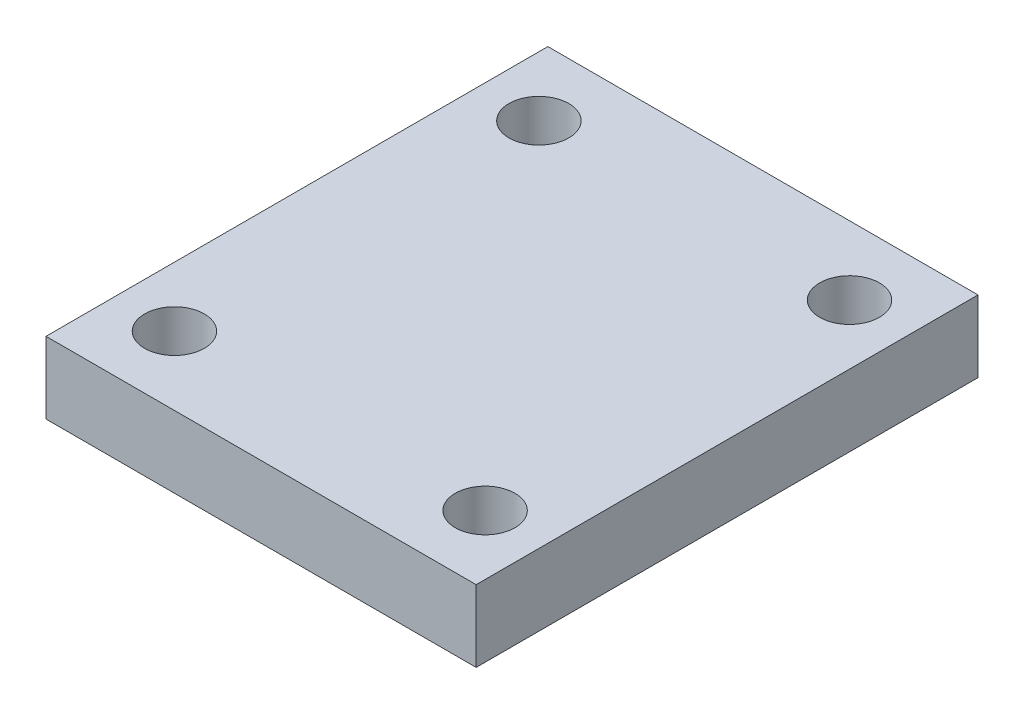
ISO-10303-21;
HEADER;
FILE_DESCRIPTION(('STEP AP214'),'2;1');
FILE_NAME('part.step','',(''),(''),'','','');
FILE_SCHEMA(('AUTOMOTIVE_DESIGN { 1 0 10303 214 1 1 1 1 }'));
ENDSEC;
DATA;
#1=APPLICATION_CONTEXT('core data for automotive mechanical design processes');
#2=APPLICATION_PROTOCOL_DEFINITION('international standard','automotive_design',2000,#1);
#3=PRODUCT_CONTEXT('',#1,'mechanical');
#4=PRODUCT('Part','Part','',(#3));
#5=PRODUCT_RELATED_PRODUCT_CATEGORY('part','',(#4));
#6=PRODUCT_DEFINITION_FORMATION('','',#4);
#7=PRODUCT_DEFINITION_CONTEXT('part definition',#1,'design');
#8=PRODUCT_DEFINITION('design','',#6,#7);
#9=PRODUCT_DEFINITION_SHAPE('','',#8);
#10=(LENGTH_UNIT() NAMED_UNIT(*) SI_UNIT(.MILLI.,.METRE.));
#11=(NAMED_UNIT(*) PLANE_ANGLE_UNIT() SI_UNIT($,.RADIAN.));
#12=(NAMED_UNIT(*) SI_UNIT($,.STERADIAN.) SOLID_ANGLE_UNIT());
#13=UNCERTAINTY_MEASURE_WITH_UNIT(LENGTH_MEASURE(1.E-05),#10,'distance_accuracy_value','');
#14=(GEOMETRIC_REPRESENTATION_CONTEXT(3) GLOBAL_UNCERTAINTY_ASSIGNED_CONTEXT((#13)) GLOBAL_UNIT_ASSIGNED_CONTEXT((#10,
#11,#12)) REPRESENTATION_CONTEXT('',''));
#15=CARTESIAN_POINT('',(0.,0.,0.));
#16=DIRECTION('',(0.,0.,1.));
#17=DIRECTION('',(1.,0.,0.));
#18=AXIS2_PLACEMENT_3D('',#15,#16,#17);
#19=CARTESIAN_POINT('',(0.,6.,0.));
#20=DIRECTION('',(0.,-1.,0.));
#21=DIRECTION('',(0.,0.,-1.));
#22=AXIS2_PLACEMENT_3D('',#19,#20,#21);
#23=PLANE('',#22);
#24=DIRECTION('',(0.,0.,-1.));
#25=VECTOR('',#24,1.);
#26=CARTESIAN_POINT('',(18.,6.,21.));
#27=LINE('',#26,#25);
#28=CARTESIAN_POINT('',(18.,6.,21.));
#29=VERTEX_POINT('',#28);
#30=CARTESIAN_POINT('',(18.,6.,-21.));
#31=VERTEX_POINT('',#30);
#32=EDGE_CURVE('E88',#29,#31,#27,.T.);
#33=ORIENTED_EDGE('',*,*,#32,.T.);
#34=DIRECTION('',(-1.,0.,0.));
#35=VECTOR('',#34,1.);
#36=CARTESIAN_POINT('',(-18.,6.,-21.));
#37=LINE('',#36,#35);
#38=CARTESIAN_POINT('',(-18.,6.,-21.));
#39=VERTEX_POINT('',#38);
#40=EDGE_CURVE('E83',#31,#39,#37,.T.);
#41=ORIENTED_EDGE('',*,*,#40,.T.);
#42=DIRECTION('',(0.,0.,1.));
#43=VECTOR('',#42,1.);
#44=CARTESIAN_POINT('',(-18.,6.,21.));
#45=LINE('',#44,#43);
#46=CARTESIAN_POINT('',(-18.,6.,21.));
#47=VERTEX_POINT('',#46);
#48=EDGE_CURVE('E86',#39,#47,#45,.T.);
#49=ORIENTED_EDGE('',*,*,#48,.T.);
#50=DIRECTION('',(1.,0.,0.));
#51=VECTOR('',#50,1.);
#52=CARTESIAN_POINT('',(-18.,6.,21.));
#53=LINE('',#52,#51);
#54=EDGE_CURVE('E53',#47,#29,#53,.T.);
#55=ORIENTED_EDGE('',*,*,#54,.T.);
#56=EDGE_LOOP('',(#33,#41,#49,#55));
#57=FACE_BOUND('',#56,.T.);
#58=CARTESIAN_POINT('',(-13.,6.,-15.25));
#59=DIRECTION('',(0.,1.,0.));
#60=DIRECTION('',(0.,0.,1.));
#61=AXIS2_PLACEMENT_3D('',#58,#59,#60);
#62=CIRCLE('',#61,2.5);
#63=CARTESIAN_POINT('',(-13.,6.,-12.75));
#64=VERTEX_POINT('',#63);
#65=EDGE_CURVE('E103',#64,#64,#62,.T.);
#66=ORIENTED_EDGE('',*,*,#65,.F.);
#67=EDGE_LOOP('',(#66));
#68=FACE_BOUND('',#67,.T.);
#69=CARTESIAN_POINT('',(-13.,6.,15.25));
#70=DIRECTION('',(0.,1.,0.));
#71=DIRECTION('',(0.,0.,-1.));
#72=AXIS2_PLACEMENT_3D('',#69,#70,#71);
#73=CIRCLE('',#72,2.5);
#74=CARTESIAN_POINT('',(-13.,6.,12.75));
#75=VERTEX_POINT('',#74);
#76=EDGE_CURVE('E118',#75,#75,#73,.T.);
#77=ORIENTED_EDGE('',*,*,#76,.F.);
#78=EDGE_LOOP('',(#77));
#79=FACE_BOUND('',#78,.T.);
#80=CARTESIAN_POINT('',(13.,6.,15.25));
#81=DIRECTION('',(0.,1.,0.));
#82=DIRECTION('',(0.,0.,1.));
#83=AXIS2_PLACEMENT_3D('',#80,#81,#82);
#84=CIRCLE('',#83,2.5);
#85=CARTESIAN_POINT('',(13.,6.,17.75));
#86=VERTEX_POINT('',#85);
#87=EDGE_CURVE('E124',#86,#86,#84,.T.);
#88=ORIENTED_EDGE('',*,*,#87,.F.);
#89=EDGE_LOOP('',(#88));
#90=FACE_BOUND('',#89,.T.);
#91=CARTESIAN_POINT('',(13.,6.,-15.25));
#92=DIRECTION('',(0.,1.,0.));
#93=DIRECTION('',(0.,0.,-1.));
#94=AXIS2_PLACEMENT_3D('',#91,#92,#93);
#95=CIRCLE('',#94,2.5);
#96=CARTESIAN_POINT('',(13.,6.,-17.75));
#97=VERTEX_POINT('',#96);
#98=EDGE_CURVE('E130',#97,#97,#95,.T.);
#99=ORIENTED_EDGE('',*,*,#98,.F.);
#100=EDGE_LOOP('',(#99));
#101=FACE_BOUND('',#100,.T.);
#102=ADVANCED_FACE('F36',(#57,#68,#79,#90,#101),#23,.F.);
#103=CARTESIAN_POINT('',(0.,0.,0.));
#104=DIRECTION('',(0.,-1.,0.));
#105=DIRECTION('',(0.,0.,-1.));
#106=AXIS2_PLACEMENT_3D('',#103,#104,#105);
#107=PLANE('',#106);
#108=CARTESIAN_POINT('',(13.,0.,15.25));
#109=DIRECTION('',(0.,1.,0.));
#110=DIRECTION('',(0.,0.,1.));
#111=AXIS2_PLACEMENT_3D('',#108,#109,#110);
#112=CIRCLE('',#111,2.5);
#113=CARTESIAN_POINT('',(13.,0.,17.75));
#114=VERTEX_POINT('',#113);
#115=EDGE_CURVE('E127',#114,#114,#112,.T.);
#116=ORIENTED_EDGE('',*,*,#115,.T.);
#117=EDGE_LOOP('',(#116));
#118=FACE_BOUND('',#117,.T.);
#119=CARTESIAN_POINT('',(-13.,0.,-15.25));
#120=DIRECTION('',(0.,1.,0.));
#121=DIRECTION('',(0.,0.,1.));
#122=AXIS2_PLACEMENT_3D('',#119,#120,#121);
#123=CIRCLE('',#122,2.5);
#124=CARTESIAN_POINT('',(-13.,0.,-12.75));
#125=VERTEX_POINT('',#124);
#126=EDGE_CURVE('E115',#125,#125,#123,.T.);
#127=ORIENTED_EDGE('',*,*,#126,.T.);
#128=EDGE_LOOP('',(#127));
#129=FACE_BOUND('',#128,.T.);
#130=DIRECTION('',(0.,0.,-1.));
#131=VECTOR('',#130,1.);
#132=CARTESIAN_POINT('',(18.,0.,21.));
#133=LINE('',#132,#131);
#134=CARTESIAN_POINT('',(18.,0.,21.));
#135=VERTEX_POINT('',#134);
#136=CARTESIAN_POINT('',(18.,0.,-21.));
#137=VERTEX_POINT('',#136);
#138=EDGE_CURVE('E100',#135,#137,#133,.T.);
#139=ORIENTED_EDGE('',*,*,#138,.F.);
#140=DIRECTION('',(1.,0.,0.));
#141=VECTOR('',#140,1.);
#142=CARTESIAN_POINT('',(-18.,0.,21.));
#143=LINE('',#142,#141);
#144=CARTESIAN_POINT('',(-18.,0.,21.));
#145=VERTEX_POINT('',#144);
#146=EDGE_CURVE('E76',#145,#135,#143,.T.);
#147=ORIENTED_EDGE('',*,*,#146,.F.);
#148=DIRECTION('',(0.,0.,1.));
#149=VECTOR('',#148,1.);
#150=CARTESIAN_POINT('',(-18.,0.,21.));
#151=LINE('',#150,#149);
#152=CARTESIAN_POINT('',(-18.,0.,-21.));
#153=VERTEX_POINT('',#152);
#154=EDGE_CURVE('E70',#153,#145,#151,.T.);
#155=ORIENTED_EDGE('',*,*,#154,.F.);
#156=DIRECTION('',(-1.,0.,0.));
#157=VECTOR('',#156,1.);
#158=CARTESIAN_POINT('',(-18.,0.,-21.));
#159=LINE('',#158,#157);
#160=EDGE_CURVE('E92',#137,#153,#159,.T.);
#161=ORIENTED_EDGE('',*,*,#160,.F.);
#162=EDGE_LOOP('',(#139,#147,#155,#161));
#163=FACE_BOUND('',#162,.T.);
#164=CARTESIAN_POINT('',(-13.,0.,15.25));
#165=DIRECTION('',(0.,1.,0.));
#166=DIRECTION('',(0.,0.,-1.));
#167=AXIS2_PLACEMENT_3D('',#164,#165,#166);
#168=CIRCLE('',#167,2.5);
#169=CARTESIAN_POINT('',(-13.,0.,12.75));
#170=VERTEX_POINT('',#169);
#171=EDGE_CURVE('E121',#170,#170,#168,.T.);
#172=ORIENTED_EDGE('',*,*,#171,.T.);
#173=EDGE_LOOP('',(#172));
#174=FACE_BOUND('',#173,.T.);
#175=CARTESIAN_POINT('',(13.,0.,-15.25));
#176=DIRECTION('',(0.,1.,0.));
#177=DIRECTION('',(0.,0.,-1.));
#178=AXIS2_PLACEMENT_3D('',#175,#176,#177);
#179=CIRCLE('',#178,2.5);
#180=CARTESIAN_POINT('',(13.,0.,-17.75));
#181=VERTEX_POINT('',#180);
#182=EDGE_CURVE('E133',#181,#181,#179,.T.);
#183=ORIENTED_EDGE('',*,*,#182,.T.);
#184=EDGE_LOOP('',(#183));
#185=FACE_BOUND('',#184,.T.);
#186=ADVANCED_FACE('F111',(#118,#129,#163,#174,#185),#107,.T.);
#187=CARTESIAN_POINT('',(18.,6.,21.));
#188=DIRECTION('',(-1.,0.,0.));
#189=DIRECTION('',(0.,0.,1.));
#190=AXIS2_PLACEMENT_3D('',#187,#188,#189);
#191=PLANE('',#190);
#192=ORIENTED_EDGE('',*,*,#138,.T.);
#193=DIRECTION('',(0.,-1.,0.));
#194=VECTOR('',#193,1.);
#195=CARTESIAN_POINT('',(18.,6.,-21.));
#196=LINE('',#195,#194);
#197=EDGE_CURVE('E11',#31,#137,#196,.T.);
#198=ORIENTED_EDGE('',*,*,#197,.F.);
#199=ORIENTED_EDGE('',*,*,#32,.F.);
#200=DIRECTION('',(0.,-1.,0.));
#201=VECTOR('',#200,1.);
#202=CARTESIAN_POINT('',(18.,6.,21.));
#203=LINE('',#202,#201);
#204=EDGE_CURVE('E96',#29,#135,#203,.T.);
#205=ORIENTED_EDGE('',*,*,#204,.T.);
#206=EDGE_LOOP('',(#192,#198,#199,#205));
#207=FACE_BOUND('',#206,.T.);
#208=ADVANCED_FACE('F38',(#207),#191,.F.);
#209=CARTESIAN_POINT('',(-18.,6.,-21.));
#210=DIRECTION('',(0.,0.,1.));
#211=DIRECTION('',(1.,0.,0.));
#212=AXIS2_PLACEMENT_3D('',#209,#210,#211);
#213=PLANE('',#212);
#214=ORIENTED_EDGE('',*,*,#160,.T.);
#215=DIRECTION('',(0.,-1.,0.));
#216=VECTOR('',#215,1.);
#217=CARTESIAN_POINT('',(-18.,6.,-21.));
#218=LINE('',#217,#216);
#219=EDGE_CURVE('E45',#39,#153,#218,.T.);
#220=ORIENTED_EDGE('',*,*,#219,.F.);
#221=ORIENTED_EDGE('',*,*,#40,.F.);
#222=ORIENTED_EDGE('',*,*,#197,.T.);
#223=EDGE_LOOP('',(#214,#220,#221,#222));
#224=FACE_BOUND('',#223,.T.);
#225=ADVANCED_FACE('F91',(#224),#213,.F.);
#226=CARTESIAN_POINT('',(-18.,6.,21.));
#227=DIRECTION('',(1.,0.,0.));
#228=DIRECTION('',(0.,0.,-1.));
#229=AXIS2_PLACEMENT_3D('',#226,#227,#228);
#230=PLANE('',#229);
#231=ORIENTED_EDGE('',*,*,#154,.T.);
#232=DIRECTION('',(0.,-1.,0.));
#233=VECTOR('',#232,1.);
#234=CARTESIAN_POINT('',(-18.,6.,21.));
#235=LINE('',#234,#233);
#236=EDGE_CURVE('E93',#47,#145,#235,.T.);
#237=ORIENTED_EDGE('',*,*,#236,.F.);
#238=ORIENTED_EDGE('',*,*,#48,.F.);
#239=ORIENTED_EDGE('',*,*,#219,.T.);
#240=EDGE_LOOP('',(#231,#237,#238,#239));
#241=FACE_BOUND('',#240,.T.);
#242=ADVANCED_FACE('F94',(#241),#230,.F.);
#243=CARTESIAN_POINT('',(-18.,6.,21.));
#244=DIRECTION('',(0.,0.,-1.));
#245=DIRECTION('',(-1.,0.,0.));
#246=AXIS2_PLACEMENT_3D('',#243,#244,#245);
#247=PLANE('',#246);
#248=ORIENTED_EDGE('',*,*,#146,.T.);
#249=ORIENTED_EDGE('',*,*,#204,.F.);
#250=ORIENTED_EDGE('',*,*,#54,.F.);
#251=ORIENTED_EDGE('',*,*,#236,.T.);
#252=EDGE_LOOP('',(#248,#249,#250,#251));
#253=FACE_BOUND('',#252,.T.);
#254=ADVANCED_FACE('F108',(#253),#247,.F.);
#255=CARTESIAN_POINT('',(-13.,6.,-15.25));
#256=DIRECTION('',(0.,-1.,0.));
#257=DIRECTION('',(0.,0.,-1.));
#258=AXIS2_PLACEMENT_3D('',#255,#256,#257);
#259=CYLINDRICAL_SURFACE('',#258,2.5);
#260=ORIENTED_EDGE('',*,*,#65,.T.);
#261=EDGE_LOOP('',(#260));
#262=FACE_BOUND('',#261,.T.);
#263=ORIENTED_EDGE('',*,*,#126,.F.);
#264=EDGE_LOOP('',(#263));
#265=FACE_BOUND('',#264,.T.);
#266=ADVANCED_FACE('F150',(#262,#265),#259,.F.);
#267=CARTESIAN_POINT('',(-13.,6.,15.25));
#268=DIRECTION('',(0.,-1.,0.));
#269=DIRECTION('',(0.,0.,-1.));
#270=AXIS2_PLACEMENT_3D('',#267,#268,#269);
#271=CYLINDRICAL_SURFACE('',#270,2.5);
#272=ORIENTED_EDGE('',*,*,#76,.T.);
#273=EDGE_LOOP('',(#272));
#274=FACE_BOUND('',#273,.T.);
#275=ORIENTED_EDGE('',*,*,#171,.F.);
#276=EDGE_LOOP('',(#275));
#277=FACE_BOUND('',#276,.T.);
#278=ADVANCED_FACE('F204',(#274,#277),#271,.F.);
#279=CARTESIAN_POINT('',(13.,6.,15.25));
#280=DIRECTION('',(0.,-1.,0.));
#281=DIRECTION('',(0.,0.,-1.));
#282=AXIS2_PLACEMENT_3D('',#279,#280,#281);
#283=CYLINDRICAL_SURFACE('',#282,2.5);
#284=ORIENTED_EDGE('',*,*,#87,.T.);
#285=EDGE_LOOP('',(#284));
#286=FACE_BOUND('',#285,.T.);
#287=ORIENTED_EDGE('',*,*,#115,.F.);
#288=EDGE_LOOP('',(#287));
#289=FACE_BOUND('',#288,.T.);
#290=ADVANCED_FACE('F213',(#286,#289),#283,.F.);
#291=CARTESIAN_POINT('',(13.,6.,-15.25));
#292=DIRECTION('',(0.,-1.,0.));
#293=DIRECTION('',(0.,0.,-1.));
#294=AXIS2_PLACEMENT_3D('',#291,#292,#293);
#295=CYLINDRICAL_SURFACE('',#294,2.5);
#296=ORIENTED_EDGE('',*,*,#98,.T.);
#297=EDGE_LOOP('',(#296));
#298=FACE_BOUND('',#297,.T.);
#299=ORIENTED_EDGE('',*,*,#182,.F.);
#300=EDGE_LOOP('',(#299));
#301=FACE_BOUND('',#300,.T.);
#302=ADVANCED_FACE('F139',(#298,#301),#295,.F.);
#303=CLOSED_SHELL('',(#102,#186,#208,#225,#242,#254,#266,#278,#290,#302));
#304=MANIFOLD_SOLID_BREP('B2',#303);
#305=ADVANCED_BREP_SHAPE_REPRESENTATION('',(#18,#304),#14);
#306=SHAPE_DEFINITION_REPRESENTATION(#9,#305);
ENDSEC;
END-ISO-10303-21;
